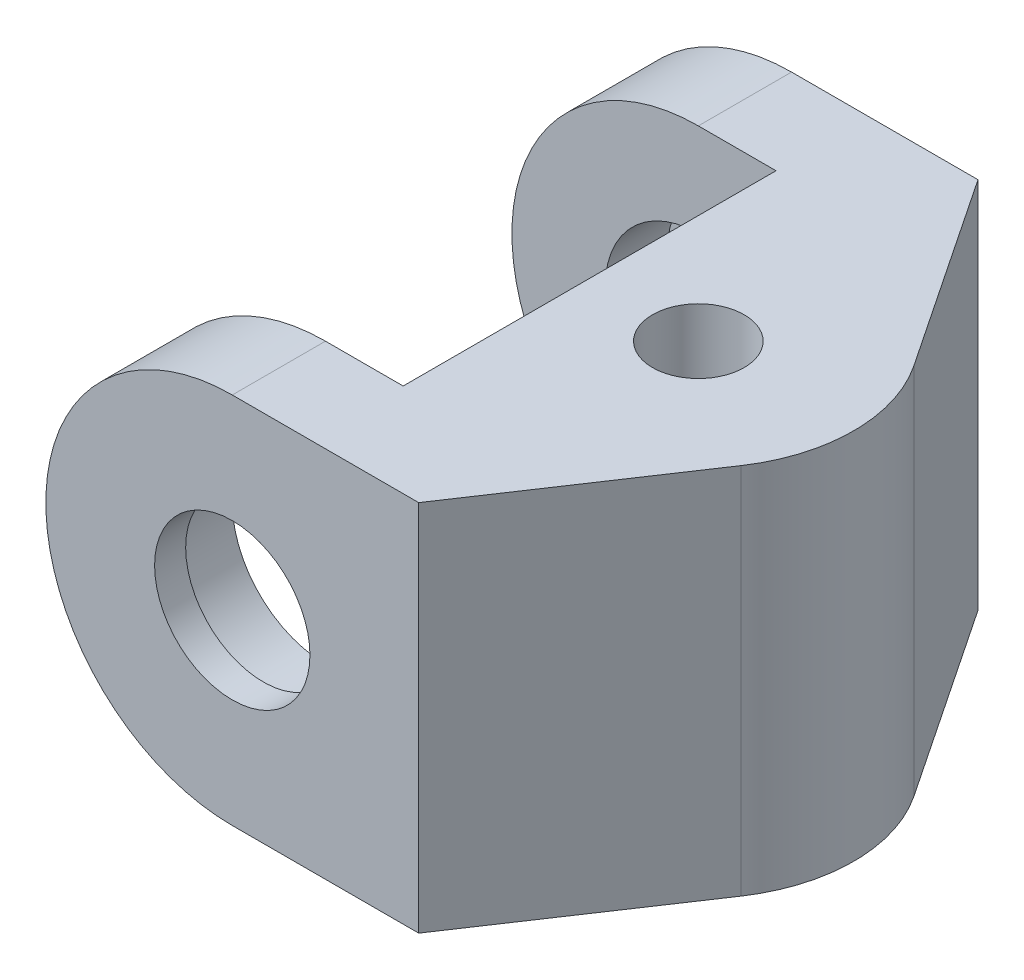
ISO-10303-21;
HEADER;
FILE_DESCRIPTION(('STEP AP214'),'2;1');
FILE_NAME('part.step','',(''),(''),'','','');
FILE_SCHEMA(('AUTOMOTIVE_DESIGN { 1 0 10303 214 1 1 1 1 }'));
ENDSEC;
DATA;
#1=APPLICATION_CONTEXT('core data for automotive mechanical design processes');
#2=APPLICATION_PROTOCOL_DEFINITION('international standard','automotive_design',2000,#1);
#3=PRODUCT_CONTEXT('',#1,'mechanical');
#4=PRODUCT('Part','Part','',(#3));
#5=PRODUCT_RELATED_PRODUCT_CATEGORY('part','',(#4));
#6=PRODUCT_DEFINITION_FORMATION('','',#4);
#7=PRODUCT_DEFINITION_CONTEXT('part definition',#1,'design');
#8=PRODUCT_DEFINITION('design','',#6,#7);
#9=PRODUCT_DEFINITION_SHAPE('','',#8);
#10=(LENGTH_UNIT() NAMED_UNIT(*) SI_UNIT(.MILLI.,.METRE.));
#11=(NAMED_UNIT(*) PLANE_ANGLE_UNIT() SI_UNIT($,.RADIAN.));
#12=(NAMED_UNIT(*) SI_UNIT($,.STERADIAN.) SOLID_ANGLE_UNIT());
#13=UNCERTAINTY_MEASURE_WITH_UNIT(LENGTH_MEASURE(1.E-05),#10,'distance_accuracy_value','');
#14=(GEOMETRIC_REPRESENTATION_CONTEXT(3) GLOBAL_UNCERTAINTY_ASSIGNED_CONTEXT((#13)) GLOBAL_UNIT_ASSIGNED_CONTEXT((#10,
#11,#12)) REPRESENTATION_CONTEXT('',''));
#15=CARTESIAN_POINT('',(0.,0.,0.));
#16=DIRECTION('',(0.,0.,1.));
#17=DIRECTION('',(1.,0.,0.));
#18=AXIS2_PLACEMENT_3D('',#15,#16,#17);
#19=CARTESIAN_POINT('',(-6.,0.,9.));
#20=DIRECTION('',(0.,0.,-1.));
#21=DIRECTION('',(-1.,0.,0.));
#22=AXIS2_PLACEMENT_3D('',#19,#20,#21);
#23=CYLINDRICAL_SURFACE('',#22,6.);
#24=CARTESIAN_POINT('',(-6.,0.,-6.));
#25=DIRECTION('',(0.,0.,-1.));
#26=DIRECTION('',(-1.,0.,0.));
#27=AXIS2_PLACEMENT_3D('',#24,#25,#26);
#28=CIRCLE('',#27,6.);
#29=CARTESIAN_POINT('',(-6.,-6.,-6.));
#30=VERTEX_POINT('',#29);
#31=CARTESIAN_POINT('',(-6.,6.,-6.));
#32=VERTEX_POINT('',#31);
#33=EDGE_CURVE('E208',#30,#32,#28,.T.);
#34=ORIENTED_EDGE('',*,*,#33,.T.);
#35=DIRECTION('',(0.,0.,1.));
#36=VECTOR('',#35,1.);
#37=CARTESIAN_POINT('',(-6.,6.,-9.));
#38=LINE('',#37,#36);
#39=CARTESIAN_POINT('',(-6.,6.,-9.));
#40=VERTEX_POINT('',#39);
#41=EDGE_CURVE('E248',#40,#32,#38,.T.);
#42=ORIENTED_EDGE('',*,*,#41,.F.);
#43=CARTESIAN_POINT('',(-6.,0.,-9.));
#44=DIRECTION('',(0.,0.,1.));
#45=DIRECTION('',(1.,0.,0.));
#46=AXIS2_PLACEMENT_3D('',#43,#44,#45);
#47=CIRCLE('',#46,6.);
#48=CARTESIAN_POINT('',(-6.,-6.,-9.));
#49=VERTEX_POINT('',#48);
#50=EDGE_CURVE('E55',#40,#49,#47,.T.);
#51=ORIENTED_EDGE('',*,*,#50,.T.);
#52=DIRECTION('',(0.,0.,1.));
#53=VECTOR('',#52,1.);
#54=CARTESIAN_POINT('',(-6.,-6.,-9.));
#55=LINE('',#54,#53);
#56=EDGE_CURVE('E270',#49,#30,#55,.T.);
#57=ORIENTED_EDGE('',*,*,#56,.T.);
#58=EDGE_LOOP('',(#34,#42,#51,#57));
#59=FACE_BOUND('',#58,.T.);
#60=ADVANCED_FACE('F48',(#59),#23,.T.);
#61=CARTESIAN_POINT('',(-6.,0.,9.));
#62=DIRECTION('',(0.,0.,-1.));
#63=DIRECTION('',(-1.,0.,0.));
#64=AXIS2_PLACEMENT_3D('',#61,#62,#63);
#65=CYLINDRICAL_SURFACE('',#64,2.5);
#66=CARTESIAN_POINT('',(-6.,0.,-9.));
#67=DIRECTION('',(0.,0.,1.));
#68=DIRECTION('',(1.,0.,0.));
#69=AXIS2_PLACEMENT_3D('',#66,#67,#68);
#70=CIRCLE('',#69,2.5);
#71=CARTESIAN_POINT('',(-3.5,0.,-9.));
#72=VERTEX_POINT('',#71);
#73=EDGE_CURVE('E299',#72,#72,#70,.T.);
#74=ORIENTED_EDGE('',*,*,#73,.F.);
#75=EDGE_LOOP('',(#74));
#76=FACE_BOUND('',#75,.T.);
#77=CARTESIAN_POINT('',(-6.,0.,-8.));
#78=DIRECTION('',(0.,0.,-1.));
#79=DIRECTION('',(-1.,0.,0.));
#80=AXIS2_PLACEMENT_3D('',#77,#78,#79);
#81=CIRCLE('',#80,2.5);
#82=CARTESIAN_POINT('',(-8.5,0.,-8.));
#83=VERTEX_POINT('',#82);
#84=EDGE_CURVE('E237',#83,#83,#81,.T.);
#85=ORIENTED_EDGE('',*,*,#84,.F.);
#86=EDGE_LOOP('',(#85));
#87=FACE_BOUND('',#86,.T.);
#88=ADVANCED_FACE('F315',(#76,#87),#65,.F.);
#89=CARTESIAN_POINT('',(-6.,0.,8.));
#90=DIRECTION('',(0.,0.,-1.));
#91=DIRECTION('',(-1.,0.,0.));
#92=AXIS2_PLACEMENT_3D('',#89,#90,#91);
#93=CIRCLE('',#92,2.5);
#94=CARTESIAN_POINT('',(-8.5,0.,8.));
#95=VERTEX_POINT('',#94);
#96=EDGE_CURVE('E215',#95,#95,#93,.T.);
#97=ORIENTED_EDGE('',*,*,#96,.T.);
#98=EDGE_LOOP('',(#97));
#99=FACE_BOUND('',#98,.T.);
#100=CARTESIAN_POINT('',(-6.,0.,9.));
#101=DIRECTION('',(0.,0.,1.));
#102=DIRECTION('',(1.,0.,0.));
#103=AXIS2_PLACEMENT_3D('',#100,#101,#102);
#104=CIRCLE('',#103,2.5);
#105=CARTESIAN_POINT('',(-3.5,0.,9.));
#106=VERTEX_POINT('',#105);
#107=EDGE_CURVE('E301',#106,#106,#104,.T.);
#108=ORIENTED_EDGE('',*,*,#107,.T.);
#109=EDGE_LOOP('',(#108));
#110=FACE_BOUND('',#109,.T.);
#111=ADVANCED_FACE('F314',(#99,#110),#65,.F.);
#112=CARTESIAN_POINT('',(0.,6.,9.));
#113=DIRECTION('',(-0.831479419283098,0.,-0.555555555555556));
#114=DIRECTION('',(-0.555555555555556,0.,0.831479419283098));
#115=AXIS2_PLACEMENT_3D('',#112,#113,#114);
#116=PLANE('',#115);
#117=DIRECTION('',(0.555555555555556,0.,-0.831479419283098));
#118=VECTOR('',#117,1.);
#119=CARTESIAN_POINT('',(0.,-6.,9.));
#120=LINE('',#119,#118);
#121=CARTESIAN_POINT('',(0.,-6.,9.));
#122=VERTEX_POINT('',#121);
#123=CARTESIAN_POINT('',(4.15739709641549,-6.,2.77777777777778));
#124=VERTEX_POINT('',#123);
#125=EDGE_CURVE('E273',#122,#124,#120,.T.);
#126=ORIENTED_EDGE('',*,*,#125,.T.);
#127=DIRECTION('',(0.,-1.,0.));
#128=VECTOR('',#127,1.);
#129=CARTESIAN_POINT('',(4.15739709641549,6.,2.77777777777778));
#130=LINE('',#129,#128);
#131=CARTESIAN_POINT('',(4.15739709641549,6.,2.77777777777778));
#132=VERTEX_POINT('',#131);
#133=EDGE_CURVE('E288',#132,#124,#130,.T.);
#134=ORIENTED_EDGE('',*,*,#133,.F.);
#135=DIRECTION('',(0.555555555555556,0.,-0.831479419283098));
#136=VECTOR('',#135,1.);
#137=CARTESIAN_POINT('',(0.,6.,9.));
#138=LINE('',#137,#136);
#139=CARTESIAN_POINT('',(0.,6.,9.));
#140=VERTEX_POINT('',#139);
#141=EDGE_CURVE('E253',#140,#132,#138,.T.);
#142=ORIENTED_EDGE('',*,*,#141,.F.);
#143=DIRECTION('',(0.,-1.,0.));
#144=VECTOR('',#143,1.);
#145=CARTESIAN_POINT('',(0.,6.,9.));
#146=LINE('',#145,#144);
#147=EDGE_CURVE('E293',#140,#122,#146,.T.);
#148=ORIENTED_EDGE('',*,*,#147,.T.);
#149=EDGE_LOOP('',(#126,#134,#142,#148));
#150=FACE_BOUND('',#149,.T.);
#151=ADVANCED_FACE('F356',(#150),#116,.F.);
#152=CARTESIAN_POINT('',(4.15739709641549,6.,-2.77777777777778));
#153=DIRECTION('',(-0.831479419283098,0.,0.555555555555556));
#154=DIRECTION('',(0.555555555555556,0.,0.831479419283098));
#155=AXIS2_PLACEMENT_3D('',#152,#153,#154);
#156=PLANE('',#155);
#157=DIRECTION('',(-0.555555555555556,0.,-0.831479419283098));
#158=VECTOR('',#157,1.);
#159=CARTESIAN_POINT('',(4.15739709641549,-6.,-2.77777777777778));
#160=LINE('',#159,#158);
#161=CARTESIAN_POINT('',(4.15739709641549,-6.,-2.77777777777778));
#162=VERTEX_POINT('',#161);
#163=CARTESIAN_POINT('',(0.,-6.,-9.));
#164=VERTEX_POINT('',#163);
#165=EDGE_CURVE('E247',#162,#164,#160,.T.);
#166=ORIENTED_EDGE('',*,*,#165,.T.);
#167=DIRECTION('',(0.,-1.,0.));
#168=VECTOR('',#167,1.);
#169=CARTESIAN_POINT('',(0.,6.,-9.));
#170=LINE('',#169,#168);
#171=CARTESIAN_POINT('',(0.,6.,-9.));
#172=VERTEX_POINT('',#171);
#173=EDGE_CURVE('E265',#172,#164,#170,.T.);
#174=ORIENTED_EDGE('',*,*,#173,.F.);
#175=DIRECTION('',(-0.555555555555556,0.,-0.831479419283098));
#176=VECTOR('',#175,1.);
#177=CARTESIAN_POINT('',(4.15739709641549,6.,-2.77777777777778));
#178=LINE('',#177,#176);
#179=CARTESIAN_POINT('',(4.15739709641549,6.,-2.77777777777778));
#180=VERTEX_POINT('',#179);
#181=EDGE_CURVE('E258',#180,#172,#178,.T.);
#182=ORIENTED_EDGE('',*,*,#181,.F.);
#183=DIRECTION('',(0.,-1.,0.));
#184=VECTOR('',#183,1.);
#185=CARTESIAN_POINT('',(4.15739709641549,6.,-2.77777777777778));
#186=LINE('',#185,#184);
#187=EDGE_CURVE('E284',#180,#162,#186,.T.);
#188=ORIENTED_EDGE('',*,*,#187,.T.);
#189=EDGE_LOOP('',(#166,#174,#182,#188));
#190=FACE_BOUND('',#189,.T.);
#191=ADVANCED_FACE('F361',(#190),#156,.F.);
#192=CARTESIAN_POINT('',(0.,-6.,0.));
#193=DIRECTION('',(0.,1.,0.));
#194=DIRECTION('',(0.,0.,1.));
#195=AXIS2_PLACEMENT_3D('',#192,#193,#194);
#196=PLANE('',#195);
#197=CARTESIAN_POINT('',(0.,-6.,0.));
#198=DIRECTION('',(0.,1.,0.));
#199=DIRECTION('',(0.,0.,1.));
#200=AXIS2_PLACEMENT_3D('',#197,#198,#199);
#201=CIRCLE('',#200,1.475);
#202=CARTESIAN_POINT('',(0.,-6.,1.475));
#203=VERTEX_POINT('',#202);
#204=EDGE_CURVE('E198',#203,#203,#201,.T.);
#205=ORIENTED_EDGE('',*,*,#204,.T.);
#206=EDGE_LOOP('',(#205));
#207=FACE_BOUND('',#206,.T.);
#208=DIRECTION('',(0.,0.,-1.));
#209=VECTOR('',#208,1.);
#210=CARTESIAN_POINT('',(-3.5,-6.,-6.));
#211=LINE('',#210,#209);
#212=CARTESIAN_POINT('',(-3.5,-6.,6.));
#213=VERTEX_POINT('',#212);
#214=CARTESIAN_POINT('',(-3.5,-6.,-6.));
#215=VERTEX_POINT('',#214);
#216=EDGE_CURVE('E171',#213,#215,#211,.T.);
#217=ORIENTED_EDGE('',*,*,#216,.T.);
#218=DIRECTION('',(-1.,0.,0.));
#219=VECTOR('',#218,1.);
#220=CARTESIAN_POINT('',(-12.,-6.,-6.));
#221=LINE('',#220,#219);
#222=EDGE_CURVE('E178',#215,#30,#221,.T.);
#223=ORIENTED_EDGE('',*,*,#222,.T.);
#224=ORIENTED_EDGE('',*,*,#56,.F.);
#225=DIRECTION('',(-1.,0.,0.));
#226=VECTOR('',#225,1.);
#227=CARTESIAN_POINT('',(0.,-6.,-9.));
#228=LINE('',#227,#226);
#229=EDGE_CURVE('E243',#164,#49,#228,.T.);
#230=ORIENTED_EDGE('',*,*,#229,.F.);
#231=ORIENTED_EDGE('',*,*,#165,.F.);
#232=CARTESIAN_POINT('',(0.,-6.,0.));
#233=DIRECTION('',(0.,1.,0.));
#234=DIRECTION('',(0.,0.,1.));
#235=AXIS2_PLACEMENT_3D('',#232,#233,#234);
#236=CIRCLE('',#235,5.);
#237=EDGE_CURVE('E295',#124,#162,#236,.T.);
#238=ORIENTED_EDGE('',*,*,#237,.F.);
#239=ORIENTED_EDGE('',*,*,#125,.F.);
#240=DIRECTION('',(1.,0.,0.));
#241=VECTOR('',#240,1.);
#242=CARTESIAN_POINT('',(-6.,-6.,9.));
#243=LINE('',#242,#241);
#244=CARTESIAN_POINT('',(-6.,-6.,9.));
#245=VERTEX_POINT('',#244);
#246=EDGE_CURVE('E272',#245,#122,#243,.T.);
#247=ORIENTED_EDGE('',*,*,#246,.F.);
#248=CARTESIAN_POINT('',(-6.,-6.,6.));
#249=VERTEX_POINT('',#248);
#250=EDGE_CURVE('E267',#249,#245,#55,.T.);
#251=ORIENTED_EDGE('',*,*,#250,.F.);
#252=DIRECTION('',(1.,0.,0.));
#253=VECTOR('',#252,1.);
#254=CARTESIAN_POINT('',(-3.5,-6.,6.));
#255=LINE('',#254,#253);
#256=EDGE_CURVE('E182',#249,#213,#255,.T.);
#257=ORIENTED_EDGE('',*,*,#256,.T.);
#258=EDGE_LOOP('',(#217,#223,#224,#230,#231,#238,#239,#247,#251,#257));
#259=FACE_BOUND('',#258,.T.);
#260=ADVANCED_FACE('F342',(#207,#259),#196,.F.);
#261=CARTESIAN_POINT('',(0.,6.,0.));
#262=DIRECTION('',(0.,1.,0.));
#263=DIRECTION('',(0.,0.,1.));
#264=AXIS2_PLACEMENT_3D('',#261,#262,#263);
#265=PLANE('',#264);
#266=DIRECTION('',(-1.,0.,0.));
#267=VECTOR('',#266,1.);
#268=CARTESIAN_POINT('',(-12.,6.,-6.));
#269=LINE('',#268,#267);
#270=CARTESIAN_POINT('',(-3.5,6.,-6.));
#271=VERTEX_POINT('',#270);
#272=EDGE_CURVE('E165',#271,#32,#269,.T.);
#273=ORIENTED_EDGE('',*,*,#272,.F.);
#274=DIRECTION('',(0.,0.,-1.));
#275=VECTOR('',#274,1.);
#276=CARTESIAN_POINT('',(-3.5,6.,-6.));
#277=LINE('',#276,#275);
#278=CARTESIAN_POINT('',(-3.5,6.,6.));
#279=VERTEX_POINT('',#278);
#280=EDGE_CURVE('E161',#279,#271,#277,.T.);
#281=ORIENTED_EDGE('',*,*,#280,.F.);
#282=DIRECTION('',(1.,0.,0.));
#283=VECTOR('',#282,1.);
#284=CARTESIAN_POINT('',(-3.5,6.,6.));
#285=LINE('',#284,#283);
#286=CARTESIAN_POINT('',(-6.,6.,6.));
#287=VERTEX_POINT('',#286);
#288=EDGE_CURVE('E154',#287,#279,#285,.T.);
#289=ORIENTED_EDGE('',*,*,#288,.F.);
#290=CARTESIAN_POINT('',(-6.,6.,9.));
#291=VERTEX_POINT('',#290);
#292=EDGE_CURVE('E250',#287,#291,#38,.T.);
#293=ORIENTED_EDGE('',*,*,#292,.T.);
#294=DIRECTION('',(1.,0.,0.));
#295=VECTOR('',#294,1.);
#296=CARTESIAN_POINT('',(-6.,6.,9.));
#297=LINE('',#296,#295);
#298=EDGE_CURVE('E255',#291,#140,#297,.T.);
#299=ORIENTED_EDGE('',*,*,#298,.T.);
#300=ORIENTED_EDGE('',*,*,#141,.T.);
#301=CARTESIAN_POINT('',(0.,6.,0.));
#302=DIRECTION('',(0.,1.,0.));
#303=DIRECTION('',(0.,0.,1.));
#304=AXIS2_PLACEMENT_3D('',#301,#302,#303);
#305=CIRCLE('',#304,5.);
#306=EDGE_CURVE('E294',#132,#180,#305,.T.);
#307=ORIENTED_EDGE('',*,*,#306,.T.);
#308=ORIENTED_EDGE('',*,*,#181,.T.);
#309=DIRECTION('',(-1.,0.,0.));
#310=VECTOR('',#309,1.);
#311=CARTESIAN_POINT('',(0.,6.,-9.));
#312=LINE('',#311,#310);
#313=EDGE_CURVE('E242',#172,#40,#312,.T.);
#314=ORIENTED_EDGE('',*,*,#313,.T.);
#315=ORIENTED_EDGE('',*,*,#41,.T.);
#316=EDGE_LOOP('',(#273,#281,#289,#293,#299,#300,#307,#308,#314,#315));
#317=FACE_BOUND('',#316,.T.);
#318=CARTESIAN_POINT('',(0.,6.,0.));
#319=DIRECTION('',(0.,1.,0.));
#320=DIRECTION('',(0.,0.,1.));
#321=AXIS2_PLACEMENT_3D('',#318,#319,#320);
#322=CIRCLE('',#321,1.475);
#323=CARTESIAN_POINT('',(0.,6.,1.475));
#324=VERTEX_POINT('',#323);
#325=EDGE_CURVE('E199',#324,#324,#322,.T.);
#326=ORIENTED_EDGE('',*,*,#325,.F.);
#327=EDGE_LOOP('',(#326));
#328=FACE_BOUND('',#327,.T.);
#329=ADVANCED_FACE('F173',(#317,#328),#265,.T.);
#330=CARTESIAN_POINT('',(0.,6.,0.));
#331=DIRECTION('',(0.,-1.,0.));
#332=DIRECTION('',(0.,0.,-1.));
#333=AXIS2_PLACEMENT_3D('',#330,#331,#332);
#334=CYLINDRICAL_SURFACE('',#333,5.);
#335=ORIENTED_EDGE('',*,*,#187,.F.);
#336=ORIENTED_EDGE('',*,*,#306,.F.);
#337=ORIENTED_EDGE('',*,*,#133,.T.);
#338=ORIENTED_EDGE('',*,*,#237,.T.);
#339=EDGE_LOOP('',(#335,#336,#337,#338));
#340=FACE_BOUND('',#339,.T.);
#341=ADVANCED_FACE('F372',(#340),#334,.T.);
#342=ORIENTED_EDGE('',*,*,#292,.F.);
#343=CARTESIAN_POINT('',(-6.,0.,6.));
#344=DIRECTION('',(0.,0.,1.));
#345=DIRECTION('',(1.,0.,0.));
#346=AXIS2_PLACEMENT_3D('',#343,#344,#345);
#347=CIRCLE('',#346,6.);
#348=EDGE_CURVE('E63',#287,#249,#347,.T.);
#349=ORIENTED_EDGE('',*,*,#348,.T.);
#350=ORIENTED_EDGE('',*,*,#250,.T.);
#351=CARTESIAN_POINT('',(-6.,0.,9.));
#352=DIRECTION('',(0.,0.,1.));
#353=DIRECTION('',(1.,0.,0.));
#354=AXIS2_PLACEMENT_3D('',#351,#352,#353);
#355=CIRCLE('',#354,6.);
#356=EDGE_CURVE('E11',#291,#245,#355,.T.);
#357=ORIENTED_EDGE('',*,*,#356,.F.);
#358=EDGE_LOOP('',(#342,#349,#350,#357));
#359=FACE_BOUND('',#358,.T.);
#360=ADVANCED_FACE('F49',(#359),#23,.T.);
#361=CARTESIAN_POINT('',(-6.,0.,9.));
#362=DIRECTION('',(0.,0.,1.));
#363=DIRECTION('',(1.,0.,0.));
#364=AXIS2_PLACEMENT_3D('',#361,#362,#363);
#365=PLANE('',#364);
#366=ORIENTED_EDGE('',*,*,#107,.F.);
#367=EDGE_LOOP('',(#366));
#368=FACE_BOUND('',#367,.T.);
#369=ORIENTED_EDGE('',*,*,#246,.T.);
#370=ORIENTED_EDGE('',*,*,#147,.F.);
#371=ORIENTED_EDGE('',*,*,#298,.F.);
#372=ORIENTED_EDGE('',*,*,#356,.T.);
#373=EDGE_LOOP('',(#369,#370,#371,#372));
#374=FACE_BOUND('',#373,.T.);
#375=ADVANCED_FACE('F352',(#368,#374),#365,.T.);
#376=CARTESIAN_POINT('',(-6.,0.,-9.));
#377=DIRECTION('',(0.,0.,1.));
#378=DIRECTION('',(1.,0.,0.));
#379=AXIS2_PLACEMENT_3D('',#376,#377,#378);
#380=PLANE('',#379);
#381=ORIENTED_EDGE('',*,*,#73,.T.);
#382=EDGE_LOOP('',(#381));
#383=FACE_BOUND('',#382,.T.);
#384=ORIENTED_EDGE('',*,*,#50,.F.);
#385=ORIENTED_EDGE('',*,*,#313,.F.);
#386=ORIENTED_EDGE('',*,*,#173,.T.);
#387=ORIENTED_EDGE('',*,*,#229,.T.);
#388=EDGE_LOOP('',(#384,#385,#386,#387));
#389=FACE_BOUND('',#388,.T.);
#390=ADVANCED_FACE('F307',(#383,#389),#380,.F.);
#391=CARTESIAN_POINT('',(-3.5,0.,-8.));
#392=DIRECTION('',(0.,0.,1.));
#393=DIRECTION('',(1.,0.,0.));
#394=AXIS2_PLACEMENT_3D('',#391,#392,#393);
#395=PLANE('',#394);
#396=ORIENTED_EDGE('',*,*,#84,.T.);
#397=EDGE_LOOP('',(#396));
#398=FACE_BOUND('',#397,.T.);
#399=CARTESIAN_POINT('',(-6.,0.,-8.));
#400=DIRECTION('',(0.,0.,-1.));
#401=DIRECTION('',(-1.,0.,0.));
#402=AXIS2_PLACEMENT_3D('',#399,#400,#401);
#403=CIRCLE('',#402,3.);
#404=CARTESIAN_POINT('',(-9.,0.,-8.));
#405=VERTEX_POINT('',#404);
#406=EDGE_CURVE('E232',#405,#405,#403,.T.);
#407=ORIENTED_EDGE('',*,*,#406,.F.);
#408=EDGE_LOOP('',(#407));
#409=FACE_BOUND('',#408,.T.);
#410=ADVANCED_FACE('F316',(#398,#409),#395,.T.);
#411=CARTESIAN_POINT('',(-6.,0.,-12.234149703983));
#412=DIRECTION('',(0.,0.,-1.));
#413=DIRECTION('',(-1.,0.,0.));
#414=AXIS2_PLACEMENT_3D('',#411,#412,#413);
#415=CYLINDRICAL_SURFACE('',#414,3.);
#416=ORIENTED_EDGE('',*,*,#406,.T.);
#417=EDGE_LOOP('',(#416));
#418=FACE_BOUND('',#417,.T.);
#419=CARTESIAN_POINT('',(-6.,0.,-6.));
#420=DIRECTION('',(0.,0.,-1.));
#421=DIRECTION('',(-1.,0.,0.));
#422=AXIS2_PLACEMENT_3D('',#419,#420,#421);
#423=CIRCLE('',#422,3.);
#424=CARTESIAN_POINT('',(-9.,0.,-6.));
#425=VERTEX_POINT('',#424);
#426=EDGE_CURVE('E233',#425,#425,#423,.T.);
#427=ORIENTED_EDGE('',*,*,#426,.F.);
#428=EDGE_LOOP('',(#427));
#429=FACE_BOUND('',#428,.T.);
#430=ADVANCED_FACE('F321',(#418,#429),#415,.F.);
#431=CARTESIAN_POINT('',(-3.,0.,-6.));
#432=DIRECTION('',(0.,0.,1.));
#433=DIRECTION('',(1.,0.,0.));
#434=AXIS2_PLACEMENT_3D('',#431,#432,#433);
#435=PLANE('',#434);
#436=ORIENTED_EDGE('',*,*,#426,.T.);
#437=EDGE_LOOP('',(#436));
#438=FACE_BOUND('',#437,.T.);
#439=CARTESIAN_POINT('',(-6.,0.,-6.));
#440=DIRECTION('',(0.,0.,-1.));
#441=DIRECTION('',(-1.,0.,0.));
#442=AXIS2_PLACEMENT_3D('',#439,#440,#441);
#443=CIRCLE('',#442,4.5);
#444=CARTESIAN_POINT('',(-3.5,3.74165738677394,-6.));
#445=VERTEX_POINT('',#444);
#446=CARTESIAN_POINT('',(-3.5,-3.74165738677394,-6.));
#447=VERTEX_POINT('',#446);
#448=EDGE_CURVE('E227',#445,#447,#443,.T.);
#449=ORIENTED_EDGE('',*,*,#448,.F.);
#450=DIRECTION('',(0.,1.,0.));
#451=VECTOR('',#450,1.);
#452=CARTESIAN_POINT('',(-3.5,-6.,-6.));
#453=LINE('',#452,#451);
#454=EDGE_CURVE('E73',#445,#271,#453,.T.);
#455=ORIENTED_EDGE('',*,*,#454,.T.);
#456=ORIENTED_EDGE('',*,*,#272,.T.);
#457=ORIENTED_EDGE('',*,*,#33,.F.);
#458=ORIENTED_EDGE('',*,*,#222,.F.);
#459=EDGE_CURVE('E191',#215,#447,#453,.T.);
#460=ORIENTED_EDGE('',*,*,#459,.T.);
#461=EDGE_LOOP('',(#449,#455,#456,#457,#458,#460));
#462=FACE_BOUND('',#461,.T.);
#463=ADVANCED_FACE('F326',(#438,#462),#435,.T.);
#464=CARTESIAN_POINT('',(-6.,0.,-12.234149703983));
#465=DIRECTION('',(0.,0.,-1.));
#466=DIRECTION('',(-1.,0.,0.));
#467=AXIS2_PLACEMENT_3D('',#464,#465,#466);
#468=CYLINDRICAL_SURFACE('',#467,4.5);
#469=DIRECTION('',(0.,0.,-1.));
#470=VECTOR('',#469,1.);
#471=CARTESIAN_POINT('',(-3.5,-3.74165738677394,-12.234149703983));
#472=LINE('',#471,#470);
#473=CARTESIAN_POINT('',(-3.5,-3.74165738677394,6.));
#474=VERTEX_POINT('',#473);
#475=EDGE_CURVE('E210',#474,#447,#472,.T.);
#476=ORIENTED_EDGE('',*,*,#475,.F.);
#477=CARTESIAN_POINT('',(-6.,0.,6.));
#478=DIRECTION('',(0.,0.,-1.));
#479=DIRECTION('',(-1.,0.,0.));
#480=AXIS2_PLACEMENT_3D('',#477,#478,#479);
#481=CIRCLE('',#480,4.5);
#482=CARTESIAN_POINT('',(-3.5,3.74165738677394,6.));
#483=VERTEX_POINT('',#482);
#484=EDGE_CURVE('E224',#483,#474,#481,.T.);
#485=ORIENTED_EDGE('',*,*,#484,.F.);
#486=DIRECTION('',(0.,0.,-1.));
#487=VECTOR('',#486,1.);
#488=CARTESIAN_POINT('',(-3.5,3.74165738677394,-12.234149703983));
#489=LINE('',#488,#487);
#490=EDGE_CURVE('E166',#445,#483,#489,.F.);
#491=ORIENTED_EDGE('',*,*,#490,.F.);
#492=ORIENTED_EDGE('',*,*,#448,.T.);
#493=EDGE_LOOP('',(#476,#485,#491,#492));
#494=FACE_BOUND('',#493,.T.);
#495=ADVANCED_FACE('F331',(#494),#468,.F.);
#496=CARTESIAN_POINT('',(-1.5,0.,6.));
#497=DIRECTION('',(0.,0.,-1.));
#498=DIRECTION('',(-1.,0.,0.));
#499=AXIS2_PLACEMENT_3D('',#496,#497,#498);
#500=PLANE('',#499);
#501=CARTESIAN_POINT('',(-6.,0.,6.));
#502=DIRECTION('',(0.,0.,-1.));
#503=DIRECTION('',(-1.,0.,0.));
#504=AXIS2_PLACEMENT_3D('',#501,#502,#503);
#505=CIRCLE('',#504,3.);
#506=CARTESIAN_POINT('',(-9.,0.,6.));
#507=VERTEX_POINT('',#506);
#508=EDGE_CURVE('E221',#507,#507,#505,.T.);
#509=ORIENTED_EDGE('',*,*,#508,.F.);
#510=EDGE_LOOP('',(#509));
#511=FACE_BOUND('',#510,.T.);
#512=ORIENTED_EDGE('',*,*,#484,.T.);
#513=DIRECTION('',(0.,1.,0.));
#514=VECTOR('',#513,1.);
#515=CARTESIAN_POINT('',(-3.5,-6.,6.));
#516=LINE('',#515,#514);
#517=EDGE_CURVE('E167',#213,#474,#516,.T.);
#518=ORIENTED_EDGE('',*,*,#517,.F.);
#519=ORIENTED_EDGE('',*,*,#256,.F.);
#520=ORIENTED_EDGE('',*,*,#348,.F.);
#521=ORIENTED_EDGE('',*,*,#288,.T.);
#522=EDGE_CURVE('E158',#483,#279,#516,.T.);
#523=ORIENTED_EDGE('',*,*,#522,.F.);
#524=EDGE_LOOP('',(#512,#518,#519,#520,#521,#523));
#525=FACE_BOUND('',#524,.T.);
#526=ADVANCED_FACE('F160',(#511,#525),#500,.T.);
#527=CARTESIAN_POINT('',(-6.,0.,-12.234149703983));
#528=DIRECTION('',(0.,0.,-1.));
#529=DIRECTION('',(-1.,0.,0.));
#530=AXIS2_PLACEMENT_3D('',#527,#528,#529);
#531=CYLINDRICAL_SURFACE('',#530,3.);
#532=ORIENTED_EDGE('',*,*,#508,.T.);
#533=EDGE_LOOP('',(#532));
#534=FACE_BOUND('',#533,.T.);
#535=CARTESIAN_POINT('',(-6.,0.,8.));
#536=DIRECTION('',(0.,0.,-1.));
#537=DIRECTION('',(-1.,0.,0.));
#538=AXIS2_PLACEMENT_3D('',#535,#536,#537);
#539=CIRCLE('',#538,3.);
#540=CARTESIAN_POINT('',(-9.,0.,8.));
#541=VERTEX_POINT('',#540);
#542=EDGE_CURVE('E220',#541,#541,#539,.T.);
#543=ORIENTED_EDGE('',*,*,#542,.F.);
#544=EDGE_LOOP('',(#543));
#545=FACE_BOUND('',#544,.T.);
#546=ADVANCED_FACE('F444',(#534,#545),#531,.F.);
#547=CARTESIAN_POINT('',(-3.,0.,8.));
#548=DIRECTION('',(0.,0.,-1.));
#549=DIRECTION('',(-1.,0.,0.));
#550=AXIS2_PLACEMENT_3D('',#547,#548,#549);
#551=PLANE('',#550);
#552=ORIENTED_EDGE('',*,*,#542,.T.);
#553=EDGE_LOOP('',(#552));
#554=FACE_BOUND('',#553,.T.);
#555=ORIENTED_EDGE('',*,*,#96,.F.);
#556=EDGE_LOOP('',(#555));
#557=FACE_BOUND('',#556,.T.);
#558=ADVANCED_FACE('F391',(#554,#557),#551,.T.);
#559=CARTESIAN_POINT('',(-3.5,-6.,-6.));
#560=DIRECTION('',(1.,0.,0.));
#561=DIRECTION('',(0.,0.,-1.));
#562=AXIS2_PLACEMENT_3D('',#559,#560,#561);
#563=PLANE('',#562);
#564=ORIENTED_EDGE('',*,*,#475,.T.);
#565=ORIENTED_EDGE('',*,*,#459,.F.);
#566=ORIENTED_EDGE('',*,*,#216,.F.);
#567=ORIENTED_EDGE('',*,*,#517,.T.);
#568=EDGE_LOOP('',(#564,#565,#566,#567));
#569=FACE_BOUND('',#568,.T.);
#570=ADVANCED_FACE('F345',(#569),#563,.F.);
#571=ORIENTED_EDGE('',*,*,#490,.T.);
#572=ORIENTED_EDGE('',*,*,#522,.T.);
#573=ORIENTED_EDGE('',*,*,#280,.T.);
#574=ORIENTED_EDGE('',*,*,#454,.F.);
#575=EDGE_LOOP('',(#571,#572,#573,#574));
#576=FACE_BOUND('',#575,.T.);
#577=ADVANCED_FACE('F168',(#576),#563,.F.);
#578=CARTESIAN_POINT('',(0.,-6.,0.));
#579=DIRECTION('',(0.,1.,0.));
#580=DIRECTION('',(0.,0.,1.));
#581=AXIS2_PLACEMENT_3D('',#578,#579,#580);
#582=CYLINDRICAL_SURFACE('',#581,1.475);
#583=CARTESIAN_POINT('',(0.,-6.,1.475));
#584=CARTESIAN_POINT('',(0.,-5.875,1.475));
#585=CARTESIAN_POINT('',(0.,-5.75,1.475));
#586=CARTESIAN_POINT('',(0.,-5.5,1.475));
#587=CARTESIAN_POINT('',(0.,-5.375,1.475));
#588=CARTESIAN_POINT('',(0.,-5.125,1.475));
#589=CARTESIAN_POINT('',(0.,-5.,1.475));
#590=CARTESIAN_POINT('',(0.,-4.75,1.475));
#591=CARTESIAN_POINT('',(0.,-4.625,1.475));
#592=CARTESIAN_POINT('',(0.,-4.375,1.475));
#593=CARTESIAN_POINT('',(0.,-4.25,1.475));
#594=CARTESIAN_POINT('',(0.,-4.,1.475));
#595=CARTESIAN_POINT('',(0.,-3.875,1.475));
#596=CARTESIAN_POINT('',(0.,-3.625,1.475));
#597=CARTESIAN_POINT('',(0.,-3.5,1.475));
#598=CARTESIAN_POINT('',(0.,-3.25,1.475));
#599=CARTESIAN_POINT('',(0.,-3.125,1.475));
#600=CARTESIAN_POINT('',(0.,-2.875,1.475));
#601=CARTESIAN_POINT('',(0.,-2.75,1.475));
#602=CARTESIAN_POINT('',(0.,-2.5,1.475));
#603=CARTESIAN_POINT('',(0.,-2.375,1.475));
#604=CARTESIAN_POINT('',(0.,-2.125,1.475));
#605=CARTESIAN_POINT('',(0.,-2.,1.475));
#606=CARTESIAN_POINT('',(0.,-1.75,1.475));
#607=CARTESIAN_POINT('',(0.,-1.625,1.475));
#608=CARTESIAN_POINT('',(0.,-1.375,1.475));
#609=CARTESIAN_POINT('',(0.,-1.25,1.475));
#610=CARTESIAN_POINT('',(0.,-1.,1.475));
#611=CARTESIAN_POINT('',(0.,-0.875,1.475));
#612=CARTESIAN_POINT('',(0.,-0.625000000000001,1.475));
#613=CARTESIAN_POINT('',(0.,-0.5,1.475));
#614=CARTESIAN_POINT('',(0.,-0.25,1.475));
#615=CARTESIAN_POINT('',(0.,-0.125,1.475));
#616=CARTESIAN_POINT('',(0.,0.125,1.475));
#617=CARTESIAN_POINT('',(0.,0.25,1.475));
#618=CARTESIAN_POINT('',(0.,0.5,1.475));
#619=CARTESIAN_POINT('',(0.,0.625000000000001,1.475));
#620=CARTESIAN_POINT('',(0.,0.875000000000001,1.475));
#621=CARTESIAN_POINT('',(0.,1.,1.475));
#622=CARTESIAN_POINT('',(0.,1.25,1.475));
#623=CARTESIAN_POINT('',(0.,1.375,1.475));
#624=CARTESIAN_POINT('',(0.,1.625,1.475));
#625=CARTESIAN_POINT('',(0.,1.75,1.475));
#626=CARTESIAN_POINT('',(0.,2.,1.475));
#627=CARTESIAN_POINT('',(0.,2.125,1.475));
#628=CARTESIAN_POINT('',(0.,2.375,1.475));
#629=CARTESIAN_POINT('',(0.,2.5,1.475));
#630=CARTESIAN_POINT('',(0.,2.75,1.475));
#631=CARTESIAN_POINT('',(0.,2.875,1.475));
#632=CARTESIAN_POINT('',(0.,3.125,1.475));
#633=CARTESIAN_POINT('',(0.,3.25,1.475));
#634=CARTESIAN_POINT('',(0.,3.5,1.475));
#635=CARTESIAN_POINT('',(0.,3.625,1.475));
#636=CARTESIAN_POINT('',(0.,3.875,1.475));
#637=CARTESIAN_POINT('',(0.,4.,1.475));
#638=CARTESIAN_POINT('',(0.,4.25,1.475));
#639=CARTESIAN_POINT('',(0.,4.375,1.475));
#640=CARTESIAN_POINT('',(0.,4.625,1.475));
#641=CARTESIAN_POINT('',(0.,4.75,1.475));
#642=CARTESIAN_POINT('',(0.,5.,1.475));
#643=CARTESIAN_POINT('',(0.,5.125,1.475));
#644=CARTESIAN_POINT('',(0.,5.375,1.475));
#645=CARTESIAN_POINT('',(0.,5.5,1.475));
#646=CARTESIAN_POINT('',(0.,5.75,1.475));
#647=CARTESIAN_POINT('',(0.,5.875,1.475));
#648=CARTESIAN_POINT('',(0.,6.,1.475));
#649=B_SPLINE_CURVE_WITH_KNOTS('',3,(#583,#584,#585,#586,#587,#588,#589,#590,#591,#592,#593,
#594,#595,#596,#597,#598,#599,#600,#601,#602,#603,#604,#605,#606,#607,#608,#609,#610,#611,#612,
#613,#614,#615,#616,#617,#618,#619,#620,#621,#622,#623,#624,#625,#626,#627,#628,#629,#630,#631,
#632,#633,#634,#635,#636,#637,#638,#639,#640,#641,#642,#643,#644,#645,#646,#647,#648),
.UNSPECIFIED.,.F.,.F.,(4,2,2,2,2,2,2,2,2,2,2,2,2,2,2,2,2,2,2,2,2,2,2,2,2,2,2,2,2,2,2,2,4),(0.,
0.374999999999999,0.75,1.125,1.5,1.875,2.25,2.625,3.,3.375,3.75,4.125,4.5,4.875,5.25,5.625,6.,
6.375,6.75,7.125,7.5,7.875,8.25,8.625,9.,9.375,9.75,10.125,10.5,10.875,11.25,11.625,12.),.UNSPECIFIED.);
#650=EDGE_CURVE('BSEAM470',#203,#324,#649,.T.);
#651=ORIENTED_EDGE('',*,*,#204,.F.);
#652=ORIENTED_EDGE('',*,*,#325,.T.);
#653=ORIENTED_EDGE('',*,*,#650,.T.);
#654=ORIENTED_EDGE('',*,*,#650,.F.);
#655=EDGE_LOOP('',(#651,#653,#652,#654));
#656=FACE_BOUND('',#655,.T.);
#657=ADVANCED_FACE('F470',(#656),#582,.F.);
#658=CLOSED_SHELL('',(#60,#88,#111,#151,#191,#260,#329,#341,#360,#375,#390,#410,#430,#463,#495,
#526,#546,#558,#570,#577,#657));
#659=MANIFOLD_SOLID_BREP('B2',#658);
#660=ADVANCED_BREP_SHAPE_REPRESENTATION('',(#18,#659),#14);
#661=SHAPE_DEFINITION_REPRESENTATION(#9,#660);
ENDSEC;
END-ISO-10303-21;
